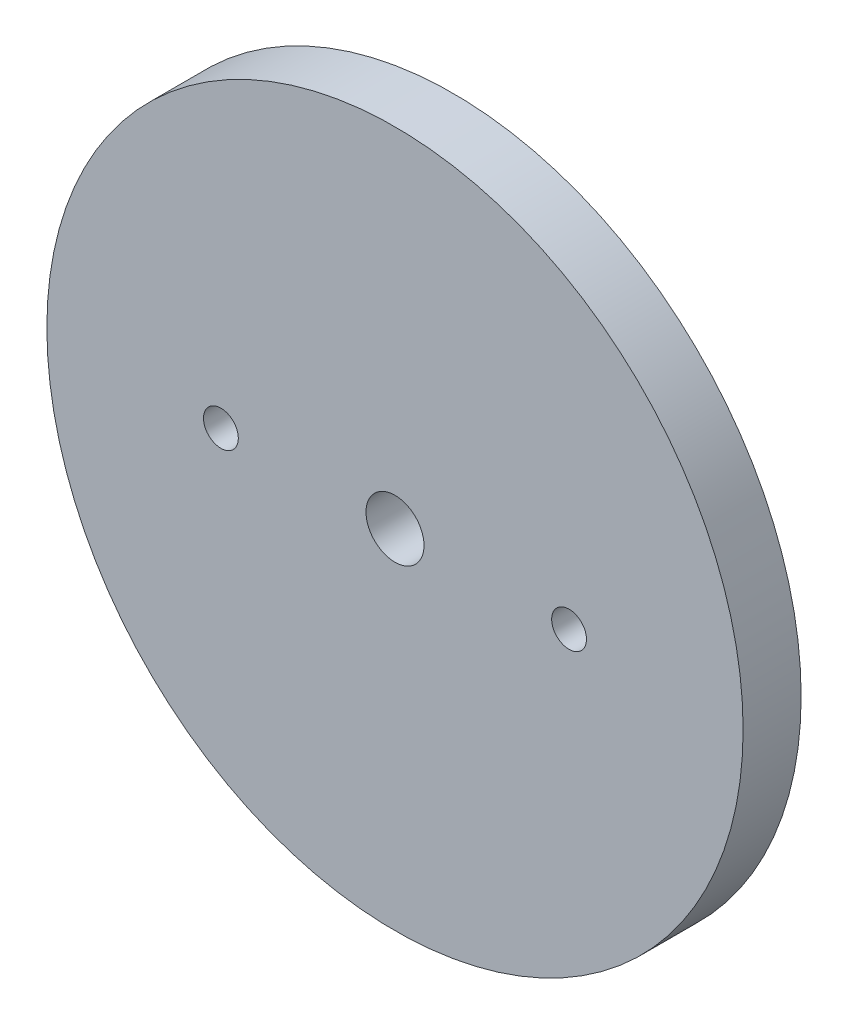
ISO-10303-21;
HEADER;
FILE_DESCRIPTION(('STEP AP214'),'2;1');
FILE_NAME('part.step','',(''),(''),'','','');
FILE_SCHEMA(('AUTOMOTIVE_DESIGN { 1 0 10303 214 1 1 1 1 }'));
ENDSEC;
DATA;
#1=APPLICATION_CONTEXT('core data for automotive mechanical design processes');
#2=APPLICATION_PROTOCOL_DEFINITION('international standard','automotive_design',2000,#1);
#3=PRODUCT_CONTEXT('',#1,'mechanical');
#4=PRODUCT('Part','Part','',(#3));
#5=PRODUCT_RELATED_PRODUCT_CATEGORY('part','',(#4));
#6=PRODUCT_DEFINITION_FORMATION('','',#4);
#7=PRODUCT_DEFINITION_CONTEXT('part definition',#1,'design');
#8=PRODUCT_DEFINITION('design','',#6,#7);
#9=PRODUCT_DEFINITION_SHAPE('','',#8);
#10=(LENGTH_UNIT() NAMED_UNIT(*) SI_UNIT(.MILLI.,.METRE.));
#11=(NAMED_UNIT(*) PLANE_ANGLE_UNIT() SI_UNIT($,.RADIAN.));
#12=(NAMED_UNIT(*) SI_UNIT($,.STERADIAN.) SOLID_ANGLE_UNIT());
#13=UNCERTAINTY_MEASURE_WITH_UNIT(LENGTH_MEASURE(1.E-05),#10,'distance_accuracy_value','');
#14=(GEOMETRIC_REPRESENTATION_CONTEXT(3) GLOBAL_UNCERTAINTY_ASSIGNED_CONTEXT((#13)) GLOBAL_UNIT_ASSIGNED_CONTEXT((#10,
#11,#12)) REPRESENTATION_CONTEXT('',''));
#15=CARTESIAN_POINT('',(0.,0.,0.));
#16=DIRECTION('',(0.,0.,1.));
#17=DIRECTION('',(1.,0.,0.));
#18=AXIS2_PLACEMENT_3D('',#15,#16,#17);
#19=CARTESIAN_POINT('',(0.,0.,10.));
#20=DIRECTION('',(0.,0.,-1.));
#21=DIRECTION('',(-1.,0.,0.));
#22=AXIS2_PLACEMENT_3D('',#19,#20,#21);
#23=CYLINDRICAL_SURFACE('',#22,60.);
#24=CARTESIAN_POINT('',(0.,0.,10.));
#25=DIRECTION('',(0.,0.,1.));
#26=DIRECTION('',(1.,0.,0.));
#27=AXIS2_PLACEMENT_3D('',#24,#25,#26);
#28=CIRCLE('',#27,60.);
#29=CARTESIAN_POINT('',(60.,0.,10.));
#30=VERTEX_POINT('',#29);
#31=EDGE_CURVE('E10',#30,#30,#28,.T.);
#32=ORIENTED_EDGE('',*,*,#31,.F.);
#33=EDGE_LOOP('',(#32));
#34=FACE_BOUND('',#33,.T.);
#35=CARTESIAN_POINT('',(0.,0.,0.));
#36=DIRECTION('',(0.,0.,1.));
#37=DIRECTION('',(1.,0.,0.));
#38=AXIS2_PLACEMENT_3D('',#35,#36,#37);
#39=CIRCLE('',#38,60.);
#40=CARTESIAN_POINT('',(60.,0.,0.));
#41=VERTEX_POINT('',#40);
#42=EDGE_CURVE('E34',#41,#41,#39,.T.);
#43=ORIENTED_EDGE('',*,*,#42,.T.);
#44=EDGE_LOOP('',(#43));
#45=FACE_BOUND('',#44,.T.);
#46=ADVANCED_FACE('F31',(#34,#45),#23,.T.);
#47=CARTESIAN_POINT('',(0.,0.,10.));
#48=DIRECTION('',(0.,0.,1.));
#49=DIRECTION('',(1.,0.,0.));
#50=AXIS2_PLACEMENT_3D('',#47,#48,#49);
#51=PLANE('',#50);
#52=CARTESIAN_POINT('',(-30.,0.,10.));
#53=DIRECTION('',(0.,0.,1.));
#54=DIRECTION('',(1.,0.,0.));
#55=AXIS2_PLACEMENT_3D('',#52,#53,#54);
#56=CIRCLE('',#55,3.);
#57=CARTESIAN_POINT('',(-27.,0.,10.));
#58=VERTEX_POINT('',#57);
#59=EDGE_CURVE('E55',#58,#58,#56,.T.);
#60=ORIENTED_EDGE('',*,*,#59,.F.);
#61=EDGE_LOOP('',(#60));
#62=FACE_BOUND('',#61,.T.);
#63=CARTESIAN_POINT('',(30.,0.,10.));
#64=DIRECTION('',(0.,0.,1.));
#65=DIRECTION('',(1.,0.,0.));
#66=AXIS2_PLACEMENT_3D('',#63,#64,#65);
#67=CIRCLE('',#66,3.);
#68=CARTESIAN_POINT('',(33.,0.,10.));
#69=VERTEX_POINT('',#68);
#70=EDGE_CURVE('E49',#69,#69,#67,.T.);
#71=ORIENTED_EDGE('',*,*,#70,.F.);
#72=EDGE_LOOP('',(#71));
#73=FACE_BOUND('',#72,.T.);
#74=CARTESIAN_POINT('',(0.,0.,10.));
#75=DIRECTION('',(0.,0.,1.));
#76=DIRECTION('',(1.,0.,0.));
#77=AXIS2_PLACEMENT_3D('',#74,#75,#76);
#78=CIRCLE('',#77,5.);
#79=CARTESIAN_POINT('',(5.,0.,10.));
#80=VERTEX_POINT('',#79);
#81=EDGE_CURVE('E43',#80,#80,#78,.T.);
#82=ORIENTED_EDGE('',*,*,#81,.F.);
#83=EDGE_LOOP('',(#82));
#84=FACE_BOUND('',#83,.T.);
#85=ORIENTED_EDGE('',*,*,#31,.T.);
#86=EDGE_LOOP('',(#85));
#87=FACE_BOUND('',#86,.T.);
#88=ADVANCED_FACE('F71',(#62,#73,#84,#87),#51,.T.);
#89=CARTESIAN_POINT('',(0.,0.,0.));
#90=DIRECTION('',(0.,0.,1.));
#91=DIRECTION('',(1.,0.,0.));
#92=AXIS2_PLACEMENT_3D('',#89,#90,#91);
#93=PLANE('',#92);
#94=CARTESIAN_POINT('',(-30.,0.,0.));
#95=DIRECTION('',(0.,0.,1.));
#96=DIRECTION('',(1.,0.,0.));
#97=AXIS2_PLACEMENT_3D('',#94,#95,#96);
#98=CIRCLE('',#97,3.);
#99=CARTESIAN_POINT('',(-27.,0.,0.));
#100=VERTEX_POINT('',#99);
#101=EDGE_CURVE('E46',#100,#100,#98,.T.);
#102=ORIENTED_EDGE('',*,*,#101,.T.);
#103=EDGE_LOOP('',(#102));
#104=FACE_BOUND('',#103,.T.);
#105=CARTESIAN_POINT('',(30.,0.,0.));
#106=DIRECTION('',(0.,0.,1.));
#107=DIRECTION('',(1.,0.,0.));
#108=AXIS2_PLACEMENT_3D('',#105,#106,#107);
#109=CIRCLE('',#108,3.);
#110=CARTESIAN_POINT('',(33.,0.,0.));
#111=VERTEX_POINT('',#110);
#112=EDGE_CURVE('E52',#111,#111,#109,.T.);
#113=ORIENTED_EDGE('',*,*,#112,.T.);
#114=EDGE_LOOP('',(#113));
#115=FACE_BOUND('',#114,.T.);
#116=CARTESIAN_POINT('',(0.,0.,0.));
#117=DIRECTION('',(0.,0.,1.));
#118=DIRECTION('',(1.,0.,0.));
#119=AXIS2_PLACEMENT_3D('',#116,#117,#118);
#120=CIRCLE('',#119,5.);
#121=CARTESIAN_POINT('',(5.,0.,0.));
#122=VERTEX_POINT('',#121);
#123=EDGE_CURVE('E41',#122,#122,#120,.T.);
#124=ORIENTED_EDGE('',*,*,#123,.T.);
#125=EDGE_LOOP('',(#124));
#126=FACE_BOUND('',#125,.T.);
#127=ORIENTED_EDGE('',*,*,#42,.F.);
#128=EDGE_LOOP('',(#127));
#129=FACE_BOUND('',#128,.T.);
#130=ADVANCED_FACE('F61',(#104,#115,#126,#129),#93,.F.);
#131=CARTESIAN_POINT('',(0.,0.,0.));
#132=DIRECTION('',(0.,0.,1.));
#133=DIRECTION('',(1.,0.,0.));
#134=AXIS2_PLACEMENT_3D('',#131,#132,#133);
#135=CYLINDRICAL_SURFACE('',#134,5.);
#136=ORIENTED_EDGE('',*,*,#123,.F.);
#137=EDGE_LOOP('',(#136));
#138=FACE_BOUND('',#137,.T.);
#139=ORIENTED_EDGE('',*,*,#81,.T.);
#140=EDGE_LOOP('',(#139));
#141=FACE_BOUND('',#140,.T.);
#142=ADVANCED_FACE('F79',(#138,#141),#135,.F.);
#143=CARTESIAN_POINT('',(30.,0.,0.));
#144=DIRECTION('',(0.,0.,1.));
#145=DIRECTION('',(1.,0.,0.));
#146=AXIS2_PLACEMENT_3D('',#143,#144,#145);
#147=CYLINDRICAL_SURFACE('',#146,3.);
#148=ORIENTED_EDGE('',*,*,#112,.F.);
#149=EDGE_LOOP('',(#148));
#150=FACE_BOUND('',#149,.T.);
#151=ORIENTED_EDGE('',*,*,#70,.T.);
#152=EDGE_LOOP('',(#151));
#153=FACE_BOUND('',#152,.T.);
#154=ADVANCED_FACE('F67',(#150,#153),#147,.F.);
#155=CARTESIAN_POINT('',(-30.,0.,0.));
#156=DIRECTION('',(0.,0.,1.));
#157=DIRECTION('',(1.,0.,0.));
#158=AXIS2_PLACEMENT_3D('',#155,#156,#157);
#159=CYLINDRICAL_SURFACE('',#158,3.);
#160=ORIENTED_EDGE('',*,*,#101,.F.);
#161=EDGE_LOOP('',(#160));
#162=FACE_BOUND('',#161,.T.);
#163=ORIENTED_EDGE('',*,*,#59,.T.);
#164=EDGE_LOOP('',(#163));
#165=FACE_BOUND('',#164,.T.);
#166=ADVANCED_FACE('F64',(#162,#165),#159,.F.);
#167=CLOSED_SHELL('',(#46,#88,#130,#142,#154,#166));
#168=MANIFOLD_SOLID_BREP('B2',#167);
#169=ADVANCED_BREP_SHAPE_REPRESENTATION('',(#18,#168),#14);
#170=SHAPE_DEFINITION_REPRESENTATION(#9,#169);
ENDSEC;
END-ISO-10303-21;
